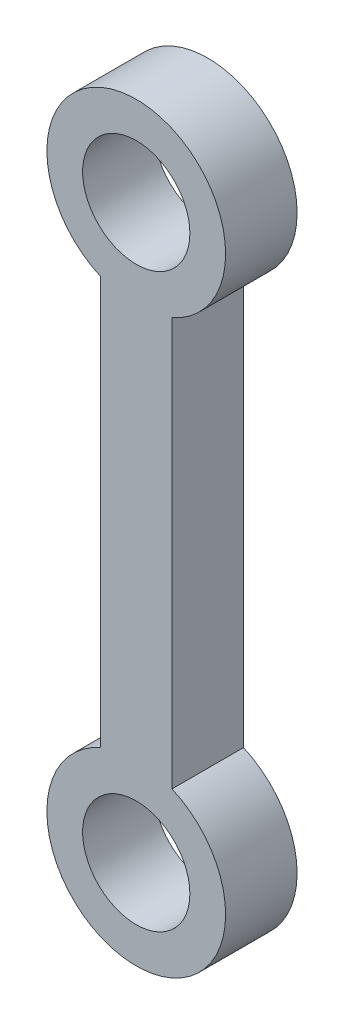
ISO-10303-21;
HEADER;
FILE_DESCRIPTION(('STEP AP214'),'2;1');
FILE_NAME('part.step','',(''),(''),'','','');
FILE_SCHEMA(('AUTOMOTIVE_DESIGN { 1 0 10303 214 1 1 1 1 }'));
ENDSEC;
DATA;
#1=APPLICATION_CONTEXT('core data for automotive mechanical design processes');
#2=APPLICATION_PROTOCOL_DEFINITION('international standard','automotive_design',2000,#1);
#3=PRODUCT_CONTEXT('',#1,'mechanical');
#4=PRODUCT('Part','Part','',(#3));
#5=PRODUCT_RELATED_PRODUCT_CATEGORY('part','',(#4));
#6=PRODUCT_DEFINITION_FORMATION('','',#4);
#7=PRODUCT_DEFINITION_CONTEXT('part definition',#1,'design');
#8=PRODUCT_DEFINITION('design','',#6,#7);
#9=PRODUCT_DEFINITION_SHAPE('','',#8);
#10=(LENGTH_UNIT() NAMED_UNIT(*) SI_UNIT(.MILLI.,.METRE.));
#11=(NAMED_UNIT(*) PLANE_ANGLE_UNIT() SI_UNIT($,.RADIAN.));
#12=(NAMED_UNIT(*) SI_UNIT($,.STERADIAN.) SOLID_ANGLE_UNIT());
#13=UNCERTAINTY_MEASURE_WITH_UNIT(LENGTH_MEASURE(1.E-05),#10,'distance_accuracy_value','');
#14=(GEOMETRIC_REPRESENTATION_CONTEXT(3) GLOBAL_UNCERTAINTY_ASSIGNED_CONTEXT((#13)) GLOBAL_UNIT_ASSIGNED_CONTEXT((#10,
#11,#12)) REPRESENTATION_CONTEXT('',''));
#15=CARTESIAN_POINT('',(0.,0.,0.));
#16=DIRECTION('',(0.,0.,1.));
#17=DIRECTION('',(1.,0.,0.));
#18=AXIS2_PLACEMENT_3D('',#15,#16,#17);
#19=CARTESIAN_POINT('',(0.,80.,10.));
#20=DIRECTION('',(0.,0.,-1.));
#21=DIRECTION('',(-1.,0.,0.));
#22=AXIS2_PLACEMENT_3D('',#19,#20,#21);
#23=CYLINDRICAL_SURFACE('',#22,12.5);
#24=CARTESIAN_POINT('',(0.,80.,0.));
#25=DIRECTION('',(0.,0.,1.));
#26=DIRECTION('',(1.,0.,0.));
#27=AXIS2_PLACEMENT_3D('',#24,#25,#26);
#28=CIRCLE('',#27,12.5);
#29=CARTESIAN_POINT('',(5.,68.5435607626104,0.));
#30=VERTEX_POINT('',#29);
#31=CARTESIAN_POINT('',(-5.,68.5435607626104,0.));
#32=VERTEX_POINT('',#31);
#33=EDGE_CURVE('E124',#30,#32,#28,.T.);
#34=ORIENTED_EDGE('',*,*,#33,.T.);
#35=DIRECTION('',(0.,0.,-1.));
#36=VECTOR('',#35,1.);
#37=CARTESIAN_POINT('',(-5.,68.5435607626104,10.));
#38=LINE('',#37,#36);
#39=CARTESIAN_POINT('',(-5.,68.5435607626104,10.));
#40=VERTEX_POINT('',#39);
#41=EDGE_CURVE('E11',#40,#32,#38,.T.);
#42=ORIENTED_EDGE('',*,*,#41,.F.);
#43=CARTESIAN_POINT('',(0.,80.,10.));
#44=DIRECTION('',(0.,0.,1.));
#45=DIRECTION('',(1.,0.,0.));
#46=AXIS2_PLACEMENT_3D('',#43,#44,#45);
#47=CIRCLE('',#46,12.5);
#48=CARTESIAN_POINT('',(5.,68.5435607626104,10.));
#49=VERTEX_POINT('',#48);
#50=EDGE_CURVE('E98',#49,#40,#47,.T.);
#51=ORIENTED_EDGE('',*,*,#50,.F.);
#52=DIRECTION('',(0.,0.,-1.));
#53=VECTOR('',#52,1.);
#54=CARTESIAN_POINT('',(5.,68.5435607626104,10.));
#55=LINE('',#54,#53);
#56=EDGE_CURVE('E64',#49,#30,#55,.T.);
#57=ORIENTED_EDGE('',*,*,#56,.T.);
#58=EDGE_LOOP('',(#34,#42,#51,#57));
#59=FACE_BOUND('',#58,.T.);
#60=ADVANCED_FACE('F47',(#59),#23,.T.);
#61=CARTESIAN_POINT('',(-5.,0.,10.));
#62=DIRECTION('',(1.,0.,0.));
#63=DIRECTION('',(0.,1.,0.));
#64=AXIS2_PLACEMENT_3D('',#61,#62,#63);
#65=PLANE('',#64);
#66=DIRECTION('',(0.,-1.,0.));
#67=VECTOR('',#66,1.);
#68=CARTESIAN_POINT('',(-5.,0.,0.));
#69=LINE('',#68,#67);
#70=CARTESIAN_POINT('',(-5.,11.4564392373896,0.));
#71=VERTEX_POINT('',#70);
#72=EDGE_CURVE('E104',#32,#71,#69,.T.);
#73=ORIENTED_EDGE('',*,*,#72,.T.);
#74=DIRECTION('',(0.,0.,-1.));
#75=VECTOR('',#74,1.);
#76=CARTESIAN_POINT('',(-5.,11.4564392373896,10.));
#77=LINE('',#76,#75);
#78=CARTESIAN_POINT('',(-5.,11.4564392373896,10.));
#79=VERTEX_POINT('',#78);
#80=EDGE_CURVE('E56',#79,#71,#77,.T.);
#81=ORIENTED_EDGE('',*,*,#80,.F.);
#82=DIRECTION('',(0.,-1.,0.));
#83=VECTOR('',#82,1.);
#84=CARTESIAN_POINT('',(-5.,0.,10.));
#85=LINE('',#84,#83);
#86=EDGE_CURVE('E90',#40,#79,#85,.T.);
#87=ORIENTED_EDGE('',*,*,#86,.F.);
#88=ORIENTED_EDGE('',*,*,#41,.T.);
#89=EDGE_LOOP('',(#73,#81,#87,#88));
#90=FACE_BOUND('',#89,.T.);
#91=ADVANCED_FACE('F103',(#90),#65,.F.);
#92=CARTESIAN_POINT('',(0.,0.,10.));
#93=DIRECTION('',(0.,0.,-1.));
#94=DIRECTION('',(-1.,0.,0.));
#95=AXIS2_PLACEMENT_3D('',#92,#93,#94);
#96=CYLINDRICAL_SURFACE('',#95,12.5);
#97=CARTESIAN_POINT('',(0.,0.,0.));
#98=DIRECTION('',(0.,0.,1.));
#99=DIRECTION('',(1.,0.,0.));
#100=AXIS2_PLACEMENT_3D('',#97,#98,#99);
#101=CIRCLE('',#100,12.5);
#102=CARTESIAN_POINT('',(5.,11.4564392373896,0.));
#103=VERTEX_POINT('',#102);
#104=EDGE_CURVE('E129',#71,#103,#101,.T.);
#105=ORIENTED_EDGE('',*,*,#104,.T.);
#106=DIRECTION('',(0.,0.,-1.));
#107=VECTOR('',#106,1.);
#108=CARTESIAN_POINT('',(5.,11.4564392373896,10.));
#109=LINE('',#108,#107);
#110=CARTESIAN_POINT('',(5.,11.4564392373896,10.));
#111=VERTEX_POINT('',#110);
#112=EDGE_CURVE('E79',#111,#103,#109,.T.);
#113=ORIENTED_EDGE('',*,*,#112,.F.);
#114=CARTESIAN_POINT('',(0.,0.,10.));
#115=DIRECTION('',(0.,0.,1.));
#116=DIRECTION('',(1.,0.,0.));
#117=AXIS2_PLACEMENT_3D('',#114,#115,#116);
#118=CIRCLE('',#117,12.5);
#119=EDGE_CURVE('E97',#79,#111,#118,.T.);
#120=ORIENTED_EDGE('',*,*,#119,.F.);
#121=ORIENTED_EDGE('',*,*,#80,.T.);
#122=EDGE_LOOP('',(#105,#113,#120,#121));
#123=FACE_BOUND('',#122,.T.);
#124=ADVANCED_FACE('F108',(#123),#96,.T.);
#125=CARTESIAN_POINT('',(0.,80.,10.));
#126=DIRECTION('',(0.,0.,-1.));
#127=DIRECTION('',(-1.,0.,0.));
#128=AXIS2_PLACEMENT_3D('',#125,#126,#127);
#129=CYLINDRICAL_SURFACE('',#128,7.5);
#130=CARTESIAN_POINT('',(0.,80.,10.));
#131=DIRECTION('',(0.,0.,1.));
#132=DIRECTION('',(1.,0.,0.));
#133=AXIS2_PLACEMENT_3D('',#130,#131,#132);
#134=CIRCLE('',#133,7.5);
#135=CARTESIAN_POINT('',(7.5,80.,10.));
#136=VERTEX_POINT('',#135);
#137=EDGE_CURVE('E113',#136,#136,#134,.T.);
#138=ORIENTED_EDGE('',*,*,#137,.T.);
#139=EDGE_LOOP('',(#138));
#140=FACE_BOUND('',#139,.T.);
#141=CARTESIAN_POINT('',(0.,80.,0.));
#142=DIRECTION('',(0.,0.,1.));
#143=DIRECTION('',(1.,0.,0.));
#144=AXIS2_PLACEMENT_3D('',#141,#142,#143);
#145=CIRCLE('',#144,7.5);
#146=CARTESIAN_POINT('',(7.5,80.,0.));
#147=VERTEX_POINT('',#146);
#148=EDGE_CURVE('E136',#147,#147,#145,.T.);
#149=ORIENTED_EDGE('',*,*,#148,.F.);
#150=EDGE_LOOP('',(#149));
#151=FACE_BOUND('',#150,.T.);
#152=ADVANCED_FACE('F162',(#140,#151),#129,.F.);
#153=CARTESIAN_POINT('',(5.,0.,10.));
#154=DIRECTION('',(1.,0.,0.));
#155=DIRECTION('',(0.,1.,0.));
#156=AXIS2_PLACEMENT_3D('',#153,#154,#155);
#157=PLANE('',#156);
#158=DIRECTION('',(0.,-1.,0.));
#159=VECTOR('',#158,1.);
#160=CARTESIAN_POINT('',(5.,0.,0.));
#161=LINE('',#160,#159);
#162=EDGE_CURVE('E132',#30,#103,#161,.T.);
#163=ORIENTED_EDGE('',*,*,#162,.F.);
#164=ORIENTED_EDGE('',*,*,#56,.F.);
#165=DIRECTION('',(0.,-1.,0.));
#166=VECTOR('',#165,1.);
#167=CARTESIAN_POINT('',(5.,0.,10.));
#168=LINE('',#167,#166);
#169=EDGE_CURVE('E110',#49,#111,#168,.T.);
#170=ORIENTED_EDGE('',*,*,#169,.T.);
#171=ORIENTED_EDGE('',*,*,#112,.T.);
#172=EDGE_LOOP('',(#163,#164,#170,#171));
#173=FACE_BOUND('',#172,.T.);
#174=ADVANCED_FACE('F154',(#173),#157,.T.);
#175=CARTESIAN_POINT('',(0.,0.,10.));
#176=DIRECTION('',(0.,0.,-1.));
#177=DIRECTION('',(-1.,0.,0.));
#178=AXIS2_PLACEMENT_3D('',#175,#176,#177);
#179=CYLINDRICAL_SURFACE('',#178,7.5);
#180=CARTESIAN_POINT('',(0.,0.,10.));
#181=DIRECTION('',(0.,0.,1.));
#182=DIRECTION('',(1.,0.,0.));
#183=AXIS2_PLACEMENT_3D('',#180,#181,#182);
#184=CIRCLE('',#183,7.5);
#185=CARTESIAN_POINT('',(7.5,0.,10.));
#186=VERTEX_POINT('',#185);
#187=EDGE_CURVE('E120',#186,#186,#184,.T.);
#188=ORIENTED_EDGE('',*,*,#187,.T.);
#189=EDGE_LOOP('',(#188));
#190=FACE_BOUND('',#189,.T.);
#191=CARTESIAN_POINT('',(0.,0.,0.));
#192=DIRECTION('',(0.,0.,1.));
#193=DIRECTION('',(1.,0.,0.));
#194=AXIS2_PLACEMENT_3D('',#191,#192,#193);
#195=CIRCLE('',#194,7.5);
#196=CARTESIAN_POINT('',(7.5,0.,0.));
#197=VERTEX_POINT('',#196);
#198=EDGE_CURVE('E140',#197,#197,#195,.T.);
#199=ORIENTED_EDGE('',*,*,#198,.F.);
#200=EDGE_LOOP('',(#199));
#201=FACE_BOUND('',#200,.T.);
#202=ADVANCED_FACE('F152',(#190,#201),#179,.F.);
#203=CARTESIAN_POINT('',(0.,0.,10.));
#204=DIRECTION('',(0.,0.,1.));
#205=DIRECTION('',(1.,0.,0.));
#206=AXIS2_PLACEMENT_3D('',#203,#204,#205);
#207=PLANE('',#206);
#208=ORIENTED_EDGE('',*,*,#50,.T.);
#209=ORIENTED_EDGE('',*,*,#86,.T.);
#210=ORIENTED_EDGE('',*,*,#119,.T.);
#211=ORIENTED_EDGE('',*,*,#169,.F.);
#212=EDGE_LOOP('',(#208,#209,#210,#211));
#213=FACE_BOUND('',#212,.T.);
#214=ORIENTED_EDGE('',*,*,#137,.F.);
#215=EDGE_LOOP('',(#214));
#216=FACE_BOUND('',#215,.T.);
#217=ORIENTED_EDGE('',*,*,#187,.F.);
#218=EDGE_LOOP('',(#217));
#219=FACE_BOUND('',#218,.T.);
#220=ADVANCED_FACE('F93',(#213,#216,#219),#207,.T.);
#221=CARTESIAN_POINT('',(0.,0.,0.));
#222=DIRECTION('',(0.,0.,1.));
#223=DIRECTION('',(1.,0.,0.));
#224=AXIS2_PLACEMENT_3D('',#221,#222,#223);
#225=PLANE('',#224);
#226=ORIENTED_EDGE('',*,*,#33,.F.);
#227=ORIENTED_EDGE('',*,*,#162,.T.);
#228=ORIENTED_EDGE('',*,*,#104,.F.);
#229=ORIENTED_EDGE('',*,*,#72,.F.);
#230=EDGE_LOOP('',(#226,#227,#228,#229));
#231=FACE_BOUND('',#230,.T.);
#232=ORIENTED_EDGE('',*,*,#148,.T.);
#233=EDGE_LOOP('',(#232));
#234=FACE_BOUND('',#233,.T.);
#235=ORIENTED_EDGE('',*,*,#198,.T.);
#236=EDGE_LOOP('',(#235));
#237=FACE_BOUND('',#236,.T.);
#238=ADVANCED_FACE('F150',(#231,#234,#237),#225,.F.);
#239=CLOSED_SHELL('',(#60,#91,#124,#152,#174,#202,#220,#238));
#240=MANIFOLD_SOLID_BREP('B2',#239);
#241=ADVANCED_BREP_SHAPE_REPRESENTATION('',(#18,#240),#14);
#242=SHAPE_DEFINITION_REPRESENTATION(#9,#241);
ENDSEC;
END-ISO-10303-21;
